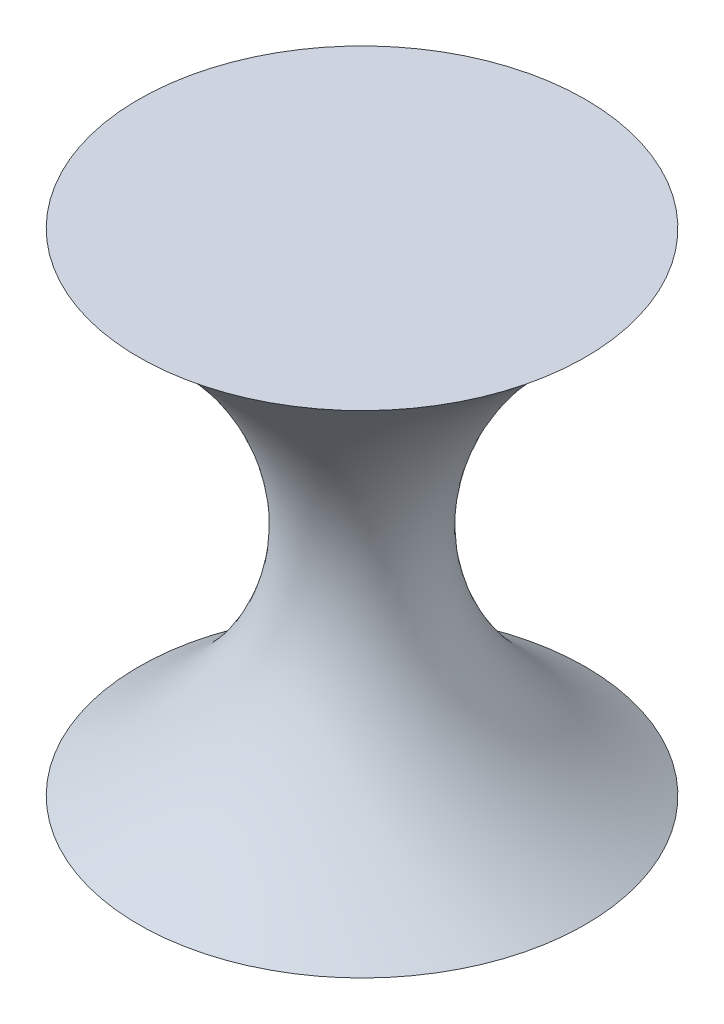
ISO-10303-21;
HEADER;
FILE_DESCRIPTION(('STEP AP214'),'2;1');
FILE_NAME('part.step','',(''),(''),'','','');
FILE_SCHEMA(('AUTOMOTIVE_DESIGN { 1 0 10303 214 1 1 1 1 }'));
ENDSEC;
DATA;
#1=APPLICATION_CONTEXT('core data for automotive mechanical design processes');
#2=APPLICATION_PROTOCOL_DEFINITION('international standard','automotive_design',2000,#1);
#3=PRODUCT_CONTEXT('',#1,'mechanical');
#4=PRODUCT('Part','Part','',(#3));
#5=PRODUCT_RELATED_PRODUCT_CATEGORY('part','',(#4));
#6=PRODUCT_DEFINITION_FORMATION('','',#4);
#7=PRODUCT_DEFINITION_CONTEXT('part definition',#1,'design');
#8=PRODUCT_DEFINITION('design','',#6,#7);
#9=PRODUCT_DEFINITION_SHAPE('','',#8);
#10=(LENGTH_UNIT() NAMED_UNIT(*) SI_UNIT(.MILLI.,.METRE.));
#11=(NAMED_UNIT(*) PLANE_ANGLE_UNIT() SI_UNIT($,.RADIAN.));
#12=(NAMED_UNIT(*) SI_UNIT($,.STERADIAN.) SOLID_ANGLE_UNIT());
#13=UNCERTAINTY_MEASURE_WITH_UNIT(LENGTH_MEASURE(1.E-05),#10,'distance_accuracy_value','');
#14=(GEOMETRIC_REPRESENTATION_CONTEXT(3) GLOBAL_UNCERTAINTY_ASSIGNED_CONTEXT((#13)) GLOBAL_UNIT_ASSIGNED_CONTEXT((#10,
#11,#12)) REPRESENTATION_CONTEXT('',''));
#15=CARTESIAN_POINT('',(0.,0.,0.));
#16=DIRECTION('',(0.,0.,1.));
#17=DIRECTION('',(1.,0.,0.));
#18=AXIS2_PLACEMENT_3D('',#15,#16,#17);
#19=CARTESIAN_POINT('',(0.,100.,0.));
#20=DIRECTION('',(0.,1.,0.));
#21=DIRECTION('',(0.,0.,1.));
#22=AXIS2_PLACEMENT_3D('',#19,#20,#21);
#23=PLANE('',#22);
#24=CARTESIAN_POINT('',(0.,100.,0.));
#25=DIRECTION('',(0.,-1.,0.));
#26=DIRECTION('',(0.,0.,-1.));
#27=AXIS2_PLACEMENT_3D('',#24,#25,#26);
#28=CIRCLE('',#27,30.);
#29=CARTESIAN_POINT('',(0.,100.,-30.));
#30=VERTEX_POINT('',#29);
#31=EDGE_CURVE('E10',#30,#30,#28,.T.);
#32=ORIENTED_EDGE('',*,*,#31,.F.);
#33=EDGE_LOOP('',(#32));
#34=FACE_BOUND('',#33,.T.);
#35=ADVANCED_FACE('F31',(#34),#23,.T.);
#36=CARTESIAN_POINT('',(30.,34.,0.));
#37=CARTESIAN_POINT('',(1.8309718775156,52.2596628169312,0.));
#38=CARTESIAN_POINT('',(1.69336868016003,77.6934053390052,0.));
#39=CARTESIAN_POINT('',(30.,100.,0.));
#40=B_SPLINE_CURVE_WITH_KNOTS('',3,(#36,#37,#38,#39),.UNSPECIFIED.,.F.,.F.,(4,4),(0.,1.),.UNSPECIFIED.);
#41=CARTESIAN_POINT('',(0.,0.,0.));
#42=DIRECTION('',(0.,-1.,0.));
#43=AXIS1_PLACEMENT('',#41,#42);
#44=SURFACE_OF_REVOLUTION('',#40,#43);
#45=ORIENTED_EDGE('',*,*,#31,.T.);
#46=EDGE_LOOP('',(#45));
#47=FACE_BOUND('',#46,.T.);
#48=CARTESIAN_POINT('',(0.,34.,0.));
#49=DIRECTION('',(0.,-1.,0.));
#50=DIRECTION('',(0.,0.,-1.));
#51=AXIS2_PLACEMENT_3D('',#48,#49,#50);
#52=CIRCLE('',#51,30.);
#53=CARTESIAN_POINT('',(0.,34.,-30.));
#54=VERTEX_POINT('',#53);
#55=EDGE_CURVE('E37',#54,#54,#52,.T.);
#56=ORIENTED_EDGE('',*,*,#55,.F.);
#57=EDGE_LOOP('',(#56));
#58=FACE_BOUND('',#57,.T.);
#59=ADVANCED_FACE('F50',(#47,#58),#44,.F.);
#60=CARTESIAN_POINT('',(30.,34.,0.));
#61=DIRECTION('',(0.,-1.,0.));
#62=DIRECTION('',(0.,0.,-1.));
#63=AXIS2_PLACEMENT_3D('',#60,#61,#62);
#64=PLANE('',#63);
#65=ORIENTED_EDGE('',*,*,#55,.T.);
#66=EDGE_LOOP('',(#65));
#67=FACE_BOUND('',#66,.T.);
#68=ADVANCED_FACE('F53',(#67),#64,.T.);
#69=CLOSED_SHELL('',(#35,#59,#68));
#70=MANIFOLD_SOLID_BREP('B2',#69);
#71=ADVANCED_BREP_SHAPE_REPRESENTATION('',(#18,#70),#14);
#72=SHAPE_DEFINITION_REPRESENTATION(#9,#71);
ENDSEC;
END-ISO-10303-21;
